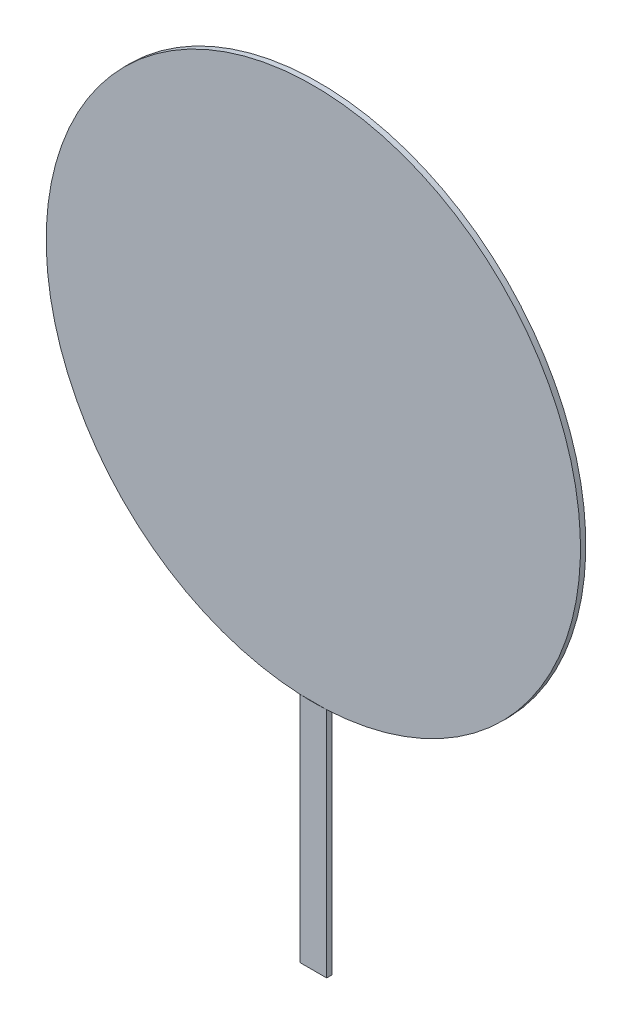
ISO-10303-21;
HEADER;
FILE_DESCRIPTION(('STEP AP214'),'2;1');
FILE_NAME('part.step','',(''),(''),'','','');
FILE_SCHEMA(('AUTOMOTIVE_DESIGN { 1 0 10303 214 1 1 1 1 }'));
ENDSEC;
DATA;
#1=APPLICATION_CONTEXT('core data for automotive mechanical design processes');
#2=APPLICATION_PROTOCOL_DEFINITION('international standard','automotive_design',2000,#1);
#3=PRODUCT_CONTEXT('',#1,'mechanical');
#4=PRODUCT('Part','Part','',(#3));
#5=PRODUCT_RELATED_PRODUCT_CATEGORY('part','',(#4));
#6=PRODUCT_DEFINITION_FORMATION('','',#4);
#7=PRODUCT_DEFINITION_CONTEXT('part definition',#1,'design');
#8=PRODUCT_DEFINITION('design','',#6,#7);
#9=PRODUCT_DEFINITION_SHAPE('','',#8);
#10=(LENGTH_UNIT() NAMED_UNIT(*) SI_UNIT(.MILLI.,.METRE.));
#11=(NAMED_UNIT(*) PLANE_ANGLE_UNIT() SI_UNIT($,.RADIAN.));
#12=(NAMED_UNIT(*) SI_UNIT($,.STERADIAN.) SOLID_ANGLE_UNIT());
#13=UNCERTAINTY_MEASURE_WITH_UNIT(LENGTH_MEASURE(1.E-05),#10,'distance_accuracy_value','');
#14=(GEOMETRIC_REPRESENTATION_CONTEXT(3) GLOBAL_UNCERTAINTY_ASSIGNED_CONTEXT((#13)) GLOBAL_UNIT_ASSIGNED_CONTEXT((#10,
#11,#12)) REPRESENTATION_CONTEXT('',''));
#15=CARTESIAN_POINT('',(0.,0.,0.));
#16=DIRECTION('',(0.,0.,1.));
#17=DIRECTION('',(1.,0.,0.));
#18=AXIS2_PLACEMENT_3D('',#15,#16,#17);
#19=CARTESIAN_POINT('',(4.99912069371519,0.,2.));
#20=DIRECTION('',(1.,0.,0.));
#21=DIRECTION('',(0.,1.,0.));
#22=AXIS2_PLACEMENT_3D('',#19,#20,#21);
#23=PLANE('',#22);
#24=DIRECTION('',(0.,-1.,0.));
#25=VECTOR('',#24,1.);
#26=CARTESIAN_POINT('',(4.99912069371519,0.,0.));
#27=LINE('',#26,#25);
#28=CARTESIAN_POINT('',(4.99912069371522,-99.8727238045687,0.));
#29=VERTEX_POINT('',#28);
#30=CARTESIAN_POINT('',(4.99912069371522,-99.8749657936846,0.));
#31=VERTEX_POINT('',#30);
#32=EDGE_CURVE('E140',#29,#31,#27,.T.);
#33=ORIENTED_EDGE('',*,*,#32,.T.);
#34=DIRECTION('',(0.,0.,-1.));
#35=VECTOR('',#34,1.);
#36=CARTESIAN_POINT('',(4.99912069371522,-99.8749657936846,2.));
#37=LINE('',#36,#35);
#38=CARTESIAN_POINT('',(4.99912069371522,-99.8749657936846,2.));
#39=VERTEX_POINT('',#38);
#40=EDGE_CURVE('E13',#39,#31,#37,.T.);
#41=ORIENTED_EDGE('',*,*,#40,.F.);
#42=DIRECTION('',(0.,-1.,0.));
#43=VECTOR('',#42,1.);
#44=CARTESIAN_POINT('',(4.99912069371519,0.,2.));
#45=LINE('',#44,#43);
#46=CARTESIAN_POINT('',(4.99912069371522,-99.8727238045687,2.));
#47=VERTEX_POINT('',#46);
#48=EDGE_CURVE('E121',#47,#39,#45,.T.);
#49=ORIENTED_EDGE('',*,*,#48,.F.);
#50=DIRECTION('',(0.,0.,-1.));
#51=VECTOR('',#50,1.);
#52=CARTESIAN_POINT('',(4.99912069371522,-99.8727238045687,2.));
#53=LINE('',#52,#51);
#54=EDGE_CURVE('E136',#47,#29,#53,.T.);
#55=ORIENTED_EDGE('',*,*,#54,.T.);
#56=EDGE_LOOP('',(#33,#41,#49,#55));
#57=FACE_BOUND('',#56,.T.);
#58=ADVANCED_FACE('F73',(#57),#23,.F.);
#59=CARTESIAN_POINT('',(0.,0.,2.));
#60=DIRECTION('',(0.,0.,-1.));
#61=DIRECTION('',(-1.,0.,0.));
#62=AXIS2_PLACEMENT_3D('',#59,#60,#61);
#63=CYLINDRICAL_SURFACE('',#62,100.);
#64=CARTESIAN_POINT('',(0.,0.,0.));
#65=DIRECTION('',(0.,0.,1.));
#66=DIRECTION('',(1.,0.,0.));
#67=AXIS2_PLACEMENT_3D('',#64,#65,#66);
#68=CIRCLE('',#67,100.);
#69=CARTESIAN_POINT('',(-5.00087930628478,-99.8748777529363,0.));
#70=VERTEX_POINT('',#69);
#71=EDGE_CURVE('E127',#31,#70,#68,.T.);
#72=ORIENTED_EDGE('',*,*,#71,.T.);
#73=DIRECTION('',(0.,0.,-1.));
#74=VECTOR('',#73,1.);
#75=CARTESIAN_POINT('',(-5.00087930628478,-99.8748777529363,2.));
#76=LINE('',#75,#74);
#77=CARTESIAN_POINT('',(-5.00087930628478,-99.8748777529363,2.));
#78=VERTEX_POINT('',#77);
#79=EDGE_CURVE('E82',#78,#70,#76,.T.);
#80=ORIENTED_EDGE('',*,*,#79,.F.);
#81=CARTESIAN_POINT('',(0.,0.,2.));
#82=DIRECTION('',(0.,0.,1.));
#83=DIRECTION('',(1.,0.,0.));
#84=AXIS2_PLACEMENT_3D('',#81,#82,#83);
#85=CIRCLE('',#84,100.);
#86=EDGE_CURVE('E116',#39,#78,#85,.T.);
#87=ORIENTED_EDGE('',*,*,#86,.F.);
#88=ORIENTED_EDGE('',*,*,#40,.T.);
#89=EDGE_LOOP('',(#72,#80,#87,#88));
#90=FACE_BOUND('',#89,.T.);
#91=ADVANCED_FACE('F126',(#90),#63,.T.);
#92=CARTESIAN_POINT('',(-5.00087930628481,0.,2.));
#93=DIRECTION('',(1.,0.,0.));
#94=DIRECTION('',(0.,1.,0.));
#95=AXIS2_PLACEMENT_3D('',#92,#93,#94);
#96=PLANE('',#95);
#97=DIRECTION('',(0.,-1.,0.));
#98=VECTOR('',#97,1.);
#99=CARTESIAN_POINT('',(-5.00087930628481,0.,0.));
#100=LINE('',#99,#98);
#101=CARTESIAN_POINT('',(-5.00087930628478,-99.8727238045687,0.));
#102=VERTEX_POINT('',#101);
#103=EDGE_CURVE('E146',#102,#70,#100,.T.);
#104=ORIENTED_EDGE('',*,*,#103,.F.);
#105=DIRECTION('',(0.,0.,-1.));
#106=VECTOR('',#105,1.);
#107=CARTESIAN_POINT('',(-5.00087930628478,-99.8727238045687,2.));
#108=LINE('',#107,#106);
#109=CARTESIAN_POINT('',(-5.00087930628478,-99.8727238045687,2.));
#110=VERTEX_POINT('',#109);
#111=EDGE_CURVE('E106',#110,#102,#108,.T.);
#112=ORIENTED_EDGE('',*,*,#111,.F.);
#113=DIRECTION('',(0.,-1.,0.));
#114=VECTOR('',#113,1.);
#115=CARTESIAN_POINT('',(-5.00087930628481,0.,2.));
#116=LINE('',#115,#114);
#117=EDGE_CURVE('E119',#110,#78,#116,.T.);
#118=ORIENTED_EDGE('',*,*,#117,.T.);
#119=ORIENTED_EDGE('',*,*,#79,.T.);
#120=EDGE_LOOP('',(#104,#112,#118,#119));
#121=FACE_BOUND('',#120,.T.);
#122=ADVANCED_FACE('F132',(#121),#96,.T.);
#123=CARTESIAN_POINT('',(0.,-99.8727238045687,2.));
#124=DIRECTION('',(0.,1.,0.));
#125=DIRECTION('',(0.,0.,1.));
#126=AXIS2_PLACEMENT_3D('',#123,#124,#125);
#127=PLANE('',#126);
#128=DIRECTION('',(1.,0.,0.));
#129=VECTOR('',#128,1.);
#130=CARTESIAN_POINT('',(0.,-99.8727238045687,0.));
#131=LINE('',#130,#129);
#132=EDGE_CURVE('E109',#102,#29,#131,.T.);
#133=ORIENTED_EDGE('',*,*,#132,.T.);
#134=ORIENTED_EDGE('',*,*,#54,.F.);
#135=DIRECTION('',(1.,0.,0.));
#136=VECTOR('',#135,1.);
#137=CARTESIAN_POINT('',(0.,-99.8727238045687,2.));
#138=LINE('',#137,#136);
#139=EDGE_CURVE('E90',#110,#47,#138,.T.);
#140=ORIENTED_EDGE('',*,*,#139,.F.);
#141=ORIENTED_EDGE('',*,*,#111,.T.);
#142=EDGE_LOOP('',(#133,#134,#140,#141));
#143=FACE_BOUND('',#142,.T.);
#144=ADVANCED_FACE('F163',(#143),#127,.F.);
#145=CARTESIAN_POINT('',(0.,0.,2.));
#146=DIRECTION('',(0.,0.,1.));
#147=DIRECTION('',(1.,0.,0.));
#148=AXIS2_PLACEMENT_3D('',#145,#146,#147);
#149=PLANE('',#148);
#150=ORIENTED_EDGE('',*,*,#48,.T.);
#151=ORIENTED_EDGE('',*,*,#86,.T.);
#152=ORIENTED_EDGE('',*,*,#117,.F.);
#153=ORIENTED_EDGE('',*,*,#139,.T.);
#154=EDGE_LOOP('',(#150,#151,#152,#153));
#155=FACE_BOUND('',#154,.T.);
#156=ADVANCED_FACE('F117',(#155),#149,.T.);
#157=CARTESIAN_POINT('',(0.,0.,0.));
#158=DIRECTION('',(0.,0.,1.));
#159=DIRECTION('',(1.,0.,0.));
#160=AXIS2_PLACEMENT_3D('',#157,#158,#159);
#161=PLANE('',#160);
#162=ORIENTED_EDGE('',*,*,#32,.F.);
#163=ORIENTED_EDGE('',*,*,#132,.F.);
#164=ORIENTED_EDGE('',*,*,#103,.T.);
#165=ORIENTED_EDGE('',*,*,#71,.F.);
#166=EDGE_LOOP('',(#162,#163,#164,#165));
#167=FACE_BOUND('',#166,.T.);
#168=ADVANCED_FACE('F157',(#167),#161,.F.);
#169=CLOSED_SHELL('',(#58,#91,#122,#144,#156,#168));
#170=MANIFOLD_SOLID_BREP('B2',#169);
#171=CARTESIAN_POINT('',(0.,0.,2.));
#172=DIRECTION('',(0.,0.,-1.));
#173=DIRECTION('',(-1.,0.,0.));
#174=AXIS2_PLACEMENT_3D('',#171,#172,#173);
#175=CYLINDRICAL_SURFACE('',#174,100.);
#176=CARTESIAN_POINT('',(0.,0.,0.));
#177=DIRECTION('',(0.,0.,1.));
#178=DIRECTION('',(1.,0.,0.));
#179=AXIS2_PLACEMENT_3D('',#176,#177,#178);
#180=CIRCLE('',#179,100.);
#181=CARTESIAN_POINT('',(-5.00087930628478,-99.8748777529363,0.));
#182=VERTEX_POINT('',#181);
#183=CARTESIAN_POINT('',(4.99912069371522,-99.8749657936846,0.));
#184=VERTEX_POINT('',#183);
#185=EDGE_CURVE('E272',#182,#184,#180,.T.);
#186=ORIENTED_EDGE('',*,*,#185,.F.);
#187=DIRECTION('',(0.,0.,-1.));
#188=VECTOR('',#187,1.);
#189=CARTESIAN_POINT('',(-5.00087930628478,-99.8748777529363,2.));
#190=LINE('',#189,#188);
#191=CARTESIAN_POINT('',(-5.00087930628478,-99.8748777529363,2.));
#192=VERTEX_POINT('',#191);
#193=EDGE_CURVE('E71',#192,#182,#190,.T.);
#194=ORIENTED_EDGE('',*,*,#193,.F.);
#195=CARTESIAN_POINT('',(0.,0.,2.));
#196=DIRECTION('',(0.,0.,1.));
#197=DIRECTION('',(1.,0.,0.));
#198=AXIS2_PLACEMENT_3D('',#195,#196,#197);
#199=CIRCLE('',#198,100.);
#200=CARTESIAN_POINT('',(4.99912069371522,-99.8749657936846,2.));
#201=VERTEX_POINT('',#200);
#202=EDGE_CURVE('E257',#192,#201,#199,.T.);
#203=ORIENTED_EDGE('',*,*,#202,.T.);
#204=DIRECTION('',(0.,0.,-1.));
#205=VECTOR('',#204,1.);
#206=CARTESIAN_POINT('',(4.99912069371522,-99.8749657936846,2.));
#207=LINE('',#206,#205);
#208=EDGE_CURVE('E225',#201,#184,#207,.T.);
#209=ORIENTED_EDGE('',*,*,#208,.T.);
#210=EDGE_LOOP('',(#186,#194,#203,#209));
#211=FACE_BOUND('',#210,.T.);
#212=ADVANCED_FACE('F209',(#211),#175,.F.);
#213=CARTESIAN_POINT('',(-5.00087930628481,0.,2.));
#214=DIRECTION('',(1.,0.,0.));
#215=DIRECTION('',(0.,1.,0.));
#216=AXIS2_PLACEMENT_3D('',#213,#214,#215);
#217=PLANE('',#216);
#218=DIRECTION('',(0.,-1.,0.));
#219=VECTOR('',#218,1.);
#220=CARTESIAN_POINT('',(-5.00087930628481,0.,0.));
#221=LINE('',#220,#219);
#222=CARTESIAN_POINT('',(-5.00087930628476,-186.847638142438,0.));
#223=VERTEX_POINT('',#222);
#224=EDGE_CURVE('E263',#182,#223,#221,.T.);
#225=ORIENTED_EDGE('',*,*,#224,.T.);
#226=DIRECTION('',(0.,0.,-1.));
#227=VECTOR('',#226,1.);
#228=CARTESIAN_POINT('',(-5.00087930628476,-186.847638142438,2.));
#229=LINE('',#228,#227);
#230=CARTESIAN_POINT('',(-5.00087930628476,-186.847638142438,2.));
#231=VERTEX_POINT('',#230);
#232=EDGE_CURVE('E217',#231,#223,#229,.T.);
#233=ORIENTED_EDGE('',*,*,#232,.F.);
#234=DIRECTION('',(0.,-1.,0.));
#235=VECTOR('',#234,1.);
#236=CARTESIAN_POINT('',(-5.00087930628481,0.,2.));
#237=LINE('',#236,#235);
#238=EDGE_CURVE('E251',#192,#231,#237,.T.);
#239=ORIENTED_EDGE('',*,*,#238,.F.);
#240=ORIENTED_EDGE('',*,*,#193,.T.);
#241=EDGE_LOOP('',(#225,#233,#239,#240));
#242=FACE_BOUND('',#241,.T.);
#243=ADVANCED_FACE('F261',(#242),#217,.F.);
#244=CARTESIAN_POINT('',(0.,-186.847638142438,2.));
#245=DIRECTION('',(0.,1.,0.));
#246=DIRECTION('',(0.,0.,1.));
#247=AXIS2_PLACEMENT_3D('',#244,#245,#246);
#248=PLANE('',#247);
#249=DIRECTION('',(1.,0.,0.));
#250=VECTOR('',#249,1.);
#251=CARTESIAN_POINT('',(0.,-186.847638142438,0.));
#252=LINE('',#251,#250);
#253=CARTESIAN_POINT('',(4.99912069371524,-186.847638142438,0.));
#254=VERTEX_POINT('',#253);
#255=EDGE_CURVE('E275',#223,#254,#252,.T.);
#256=ORIENTED_EDGE('',*,*,#255,.T.);
#257=DIRECTION('',(0.,0.,-1.));
#258=VECTOR('',#257,1.);
#259=CARTESIAN_POINT('',(4.99912069371524,-186.847638142438,2.));
#260=LINE('',#259,#258);
#261=CARTESIAN_POINT('',(4.99912069371524,-186.847638142438,2.));
#262=VERTEX_POINT('',#261);
#263=EDGE_CURVE('E239',#262,#254,#260,.T.);
#264=ORIENTED_EDGE('',*,*,#263,.F.);
#265=DIRECTION('',(1.,0.,0.));
#266=VECTOR('',#265,1.);
#267=CARTESIAN_POINT('',(0.,-186.847638142438,2.));
#268=LINE('',#267,#266);
#269=EDGE_CURVE('E256',#231,#262,#268,.T.);
#270=ORIENTED_EDGE('',*,*,#269,.F.);
#271=ORIENTED_EDGE('',*,*,#232,.T.);
#272=EDGE_LOOP('',(#256,#264,#270,#271));
#273=FACE_BOUND('',#272,.T.);
#274=ADVANCED_FACE('F266',(#273),#248,.F.);
#275=CARTESIAN_POINT('',(4.99912069371519,0.,2.));
#276=DIRECTION('',(1.,0.,0.));
#277=DIRECTION('',(0.,1.,0.));
#278=AXIS2_PLACEMENT_3D('',#275,#276,#277);
#279=PLANE('',#278);
#280=DIRECTION('',(0.,-1.,0.));
#281=VECTOR('',#280,1.);
#282=CARTESIAN_POINT('',(4.99912069371519,0.,0.));
#283=LINE('',#282,#281);
#284=EDGE_CURVE('E277',#184,#254,#283,.T.);
#285=ORIENTED_EDGE('',*,*,#284,.F.);
#286=ORIENTED_EDGE('',*,*,#208,.F.);
#287=DIRECTION('',(0.,-1.,0.));
#288=VECTOR('',#287,1.);
#289=CARTESIAN_POINT('',(4.99912069371519,0.,2.));
#290=LINE('',#289,#288);
#291=EDGE_CURVE('E267',#201,#262,#290,.T.);
#292=ORIENTED_EDGE('',*,*,#291,.T.);
#293=ORIENTED_EDGE('',*,*,#263,.T.);
#294=EDGE_LOOP('',(#285,#286,#292,#293));
#295=FACE_BOUND('',#294,.T.);
#296=ADVANCED_FACE('F282',(#295),#279,.T.);
#297=CARTESIAN_POINT('',(0.,0.,2.));
#298=DIRECTION('',(0.,0.,1.));
#299=DIRECTION('',(1.,0.,0.));
#300=AXIS2_PLACEMENT_3D('',#297,#298,#299);
#301=PLANE('',#300);
#302=ORIENTED_EDGE('',*,*,#202,.F.);
#303=ORIENTED_EDGE('',*,*,#238,.T.);
#304=ORIENTED_EDGE('',*,*,#269,.T.);
#305=ORIENTED_EDGE('',*,*,#291,.F.);
#306=EDGE_LOOP('',(#302,#303,#304,#305));
#307=FACE_BOUND('',#306,.T.);
#308=ADVANCED_FACE('F253',(#307),#301,.T.);
#309=CARTESIAN_POINT('',(0.,0.,0.));
#310=DIRECTION('',(0.,0.,1.));
#311=DIRECTION('',(1.,0.,0.));
#312=AXIS2_PLACEMENT_3D('',#309,#310,#311);
#313=PLANE('',#312);
#314=ORIENTED_EDGE('',*,*,#185,.T.);
#315=ORIENTED_EDGE('',*,*,#284,.T.);
#316=ORIENTED_EDGE('',*,*,#255,.F.);
#317=ORIENTED_EDGE('',*,*,#224,.F.);
#318=EDGE_LOOP('',(#314,#315,#316,#317));
#319=FACE_BOUND('',#318,.T.);
#320=ADVANCED_FACE('F289',(#319),#313,.F.);
#321=CLOSED_SHELL('',(#212,#243,#274,#296,#308,#320));
#322=MANIFOLD_SOLID_BREP('B7',#321);
#323=ADVANCED_BREP_SHAPE_REPRESENTATION('',(#18,#170,#322),#14);
#324=SHAPE_DEFINITION_REPRESENTATION(#9,#323);
ENDSEC;
END-ISO-10303-21;
